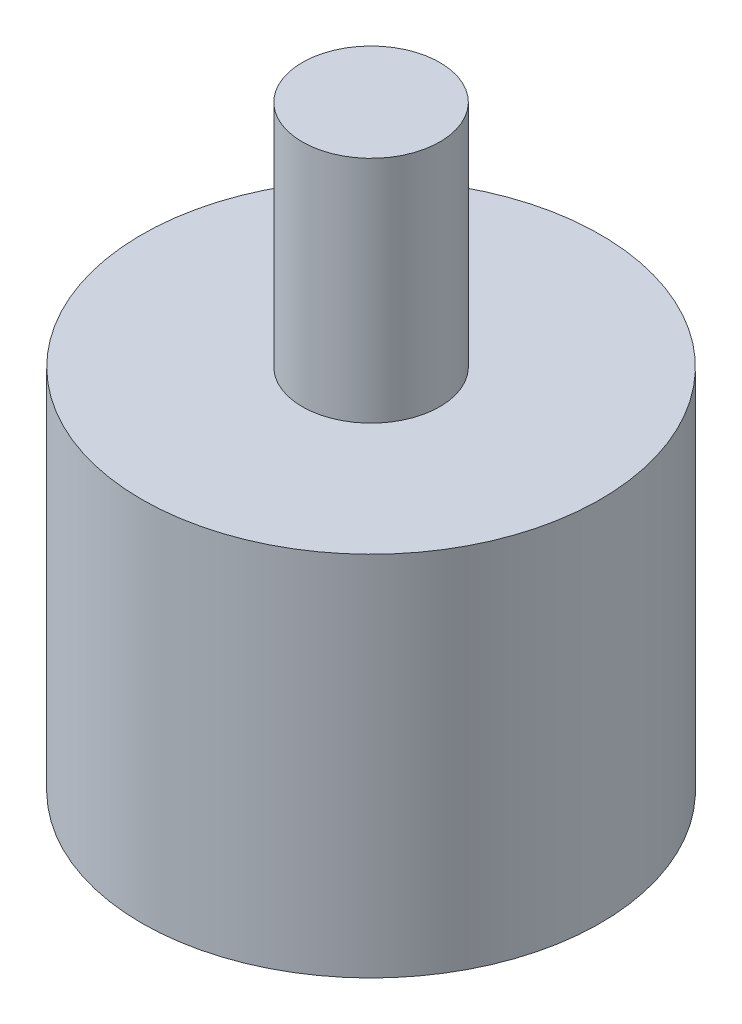
ISO-10303-21;
HEADER;
FILE_DESCRIPTION(('STEP AP214'),'2;1');
FILE_NAME('part.step','',(''),(''),'','','');
FILE_SCHEMA(('AUTOMOTIVE_DESIGN { 1 0 10303 214 1 1 1 1 }'));
ENDSEC;
DATA;
#1=APPLICATION_CONTEXT('core data for automotive mechanical design processes');
#2=APPLICATION_PROTOCOL_DEFINITION('international standard','automotive_design',2000,#1);
#3=PRODUCT_CONTEXT('',#1,'mechanical');
#4=PRODUCT('Part','Part','',(#3));
#5=PRODUCT_RELATED_PRODUCT_CATEGORY('part','',(#4));
#6=PRODUCT_DEFINITION_FORMATION('','',#4);
#7=PRODUCT_DEFINITION_CONTEXT('part definition',#1,'design');
#8=PRODUCT_DEFINITION('design','',#6,#7);
#9=PRODUCT_DEFINITION_SHAPE('','',#8);
#10=(LENGTH_UNIT() NAMED_UNIT(*) SI_UNIT(.MILLI.,.METRE.));
#11=(NAMED_UNIT(*) PLANE_ANGLE_UNIT() SI_UNIT($,.RADIAN.));
#12=(NAMED_UNIT(*) SI_UNIT($,.STERADIAN.) SOLID_ANGLE_UNIT());
#13=UNCERTAINTY_MEASURE_WITH_UNIT(LENGTH_MEASURE(1.E-05),#10,'distance_accuracy_value','');
#14=(GEOMETRIC_REPRESENTATION_CONTEXT(3) GLOBAL_UNCERTAINTY_ASSIGNED_CONTEXT((#13)) GLOBAL_UNIT_ASSIGNED_CONTEXT((#10,
#11,#12)) REPRESENTATION_CONTEXT('',''));
#15=CARTESIAN_POINT('',(0.,0.,0.));
#16=DIRECTION('',(0.,0.,1.));
#17=DIRECTION('',(1.,0.,0.));
#18=AXIS2_PLACEMENT_3D('',#15,#16,#17);
#19=CARTESIAN_POINT('',(0.,8.,0.));
#20=DIRECTION('',(0.,1.,0.));
#21=DIRECTION('',(0.,0.,1.));
#22=AXIS2_PLACEMENT_3D('',#19,#20,#21);
#23=PLANE('',#22);
#24=CARTESIAN_POINT('',(0.,8.,0.));
#25=DIRECTION('',(0.,1.,0.));
#26=DIRECTION('',(0.,0.,1.));
#27=AXIS2_PLACEMENT_3D('',#24,#25,#26);
#28=CIRCLE('',#27,5.);
#29=CARTESIAN_POINT('',(0.,8.,5.));
#30=VERTEX_POINT('',#29);
#31=EDGE_CURVE('E46',#30,#30,#28,.T.);
#32=ORIENTED_EDGE('',*,*,#31,.T.);
#33=EDGE_LOOP('',(#32));
#34=FACE_BOUND('',#33,.T.);
#35=CARTESIAN_POINT('',(0.,8.,0.));
#36=DIRECTION('',(0.,1.,0.));
#37=DIRECTION('',(0.,0.,1.));
#38=AXIS2_PLACEMENT_3D('',#35,#36,#37);
#39=CIRCLE('',#38,1.5);
#40=CARTESIAN_POINT('',(0.,8.,1.5));
#41=VERTEX_POINT('',#40);
#42=EDGE_CURVE('E52',#41,#41,#39,.T.);
#43=ORIENTED_EDGE('',*,*,#42,.F.);
#44=EDGE_LOOP('',(#43));
#45=FACE_BOUND('',#44,.T.);
#46=ADVANCED_FACE('F31',(#34,#45),#23,.T.);
#47=CARTESIAN_POINT('',(0.,0.,0.));
#48=DIRECTION('',(0.,1.,0.));
#49=DIRECTION('',(0.,0.,1.));
#50=AXIS2_PLACEMENT_3D('',#47,#48,#49);
#51=PLANE('',#50);
#52=CARTESIAN_POINT('',(0.,0.,0.));
#53=DIRECTION('',(0.,1.,0.));
#54=DIRECTION('',(0.,0.,1.));
#55=AXIS2_PLACEMENT_3D('',#52,#53,#54);
#56=CIRCLE('',#55,5.);
#57=CARTESIAN_POINT('',(0.,0.,5.));
#58=VERTEX_POINT('',#57);
#59=EDGE_CURVE('E10',#58,#58,#56,.T.);
#60=ORIENTED_EDGE('',*,*,#59,.F.);
#61=EDGE_LOOP('',(#60));
#62=FACE_BOUND('',#61,.T.);
#63=CARTESIAN_POINT('',(0.,0.,0.));
#64=DIRECTION('',(0.,1.,0.));
#65=DIRECTION('',(0.,0.,1.));
#66=AXIS2_PLACEMENT_3D('',#63,#64,#65);
#67=CIRCLE('',#66,2.95);
#68=CARTESIAN_POINT('',(0.,0.,2.95));
#69=VERTEX_POINT('',#68);
#70=EDGE_CURVE('E38',#69,#69,#67,.T.);
#71=ORIENTED_EDGE('',*,*,#70,.T.);
#72=EDGE_LOOP('',(#71));
#73=FACE_BOUND('',#72,.T.);
#74=ADVANCED_FACE('F68',(#62,#73),#51,.F.);
#75=CARTESIAN_POINT('',(0.,5.,0.));
#76=DIRECTION('',(0.,-1.,0.));
#77=DIRECTION('',(0.,0.,-1.));
#78=AXIS2_PLACEMENT_3D('',#75,#76,#77);
#79=CYLINDRICAL_SURFACE('',#78,5.);
#80=ORIENTED_EDGE('',*,*,#59,.T.);
#81=EDGE_LOOP('',(#80));
#82=FACE_BOUND('',#81,.T.);
#83=ORIENTED_EDGE('',*,*,#31,.F.);
#84=EDGE_LOOP('',(#83));
#85=FACE_BOUND('',#84,.T.);
#86=ADVANCED_FACE('F33',(#82,#85),#79,.T.);
#87=CARTESIAN_POINT('',(0.,5.,0.));
#88=DIRECTION('',(0.,-1.,0.));
#89=DIRECTION('',(0.,0.,-1.));
#90=AXIS2_PLACEMENT_3D('',#87,#88,#89);
#91=CYLINDRICAL_SURFACE('',#90,2.95);
#92=CARTESIAN_POINT('',(0.,5.,0.));
#93=DIRECTION('',(0.,1.,0.));
#94=DIRECTION('',(0.,0.,1.));
#95=AXIS2_PLACEMENT_3D('',#92,#93,#94);
#96=CIRCLE('',#95,2.95);
#97=CARTESIAN_POINT('',(0.,5.,2.95));
#98=VERTEX_POINT('',#97);
#99=EDGE_CURVE('E42',#98,#98,#96,.T.);
#100=ORIENTED_EDGE('',*,*,#99,.T.);
#101=EDGE_LOOP('',(#100));
#102=FACE_BOUND('',#101,.T.);
#103=ORIENTED_EDGE('',*,*,#70,.F.);
#104=EDGE_LOOP('',(#103));
#105=FACE_BOUND('',#104,.T.);
#106=ADVANCED_FACE('F79',(#102,#105),#91,.F.);
#107=CARTESIAN_POINT('',(0.,5.,0.));
#108=DIRECTION('',(0.,1.,0.));
#109=DIRECTION('',(0.,0.,1.));
#110=AXIS2_PLACEMENT_3D('',#107,#108,#109);
#111=PLANE('',#110);
#112=ORIENTED_EDGE('',*,*,#99,.F.);
#113=EDGE_LOOP('',(#112));
#114=FACE_BOUND('',#113,.T.);
#115=ADVANCED_FACE('F63',(#114),#111,.F.);
#116=CARTESIAN_POINT('',(0.,13.,0.));
#117=DIRECTION('',(0.,-1.,0.));
#118=DIRECTION('',(0.,0.,-1.));
#119=AXIS2_PLACEMENT_3D('',#116,#117,#118);
#120=CYLINDRICAL_SURFACE('',#119,1.5);
#121=CARTESIAN_POINT('',(0.,13.,0.));
#122=DIRECTION('',(0.,1.,0.));
#123=DIRECTION('',(0.,0.,1.));
#124=AXIS2_PLACEMENT_3D('',#121,#122,#123);
#125=CIRCLE('',#124,1.5);
#126=CARTESIAN_POINT('',(0.,13.,1.5));
#127=VERTEX_POINT('',#126);
#128=EDGE_CURVE('E51',#127,#127,#125,.T.);
#129=ORIENTED_EDGE('',*,*,#128,.F.);
#130=EDGE_LOOP('',(#129));
#131=FACE_BOUND('',#130,.T.);
#132=ORIENTED_EDGE('',*,*,#42,.T.);
#133=EDGE_LOOP('',(#132));
#134=FACE_BOUND('',#133,.T.);
#135=ADVANCED_FACE('F60',(#131,#134),#120,.T.);
#136=CARTESIAN_POINT('',(0.,13.,0.));
#137=DIRECTION('',(0.,1.,0.));
#138=DIRECTION('',(0.,0.,1.));
#139=AXIS2_PLACEMENT_3D('',#136,#137,#138);
#140=PLANE('',#139);
#141=ORIENTED_EDGE('',*,*,#128,.T.);
#142=EDGE_LOOP('',(#141));
#143=FACE_BOUND('',#142,.T.);
#144=ADVANCED_FACE('F58',(#143),#140,.T.);
#145=CLOSED_SHELL('',(#46,#74,#86,#106,#115,#135,#144));
#146=MANIFOLD_SOLID_BREP('B2',#145);
#147=ADVANCED_BREP_SHAPE_REPRESENTATION('',(#18,#146),#14);
#148=SHAPE_DEFINITION_REPRESENTATION(#9,#147);
ENDSEC;
END-ISO-10303-21;
